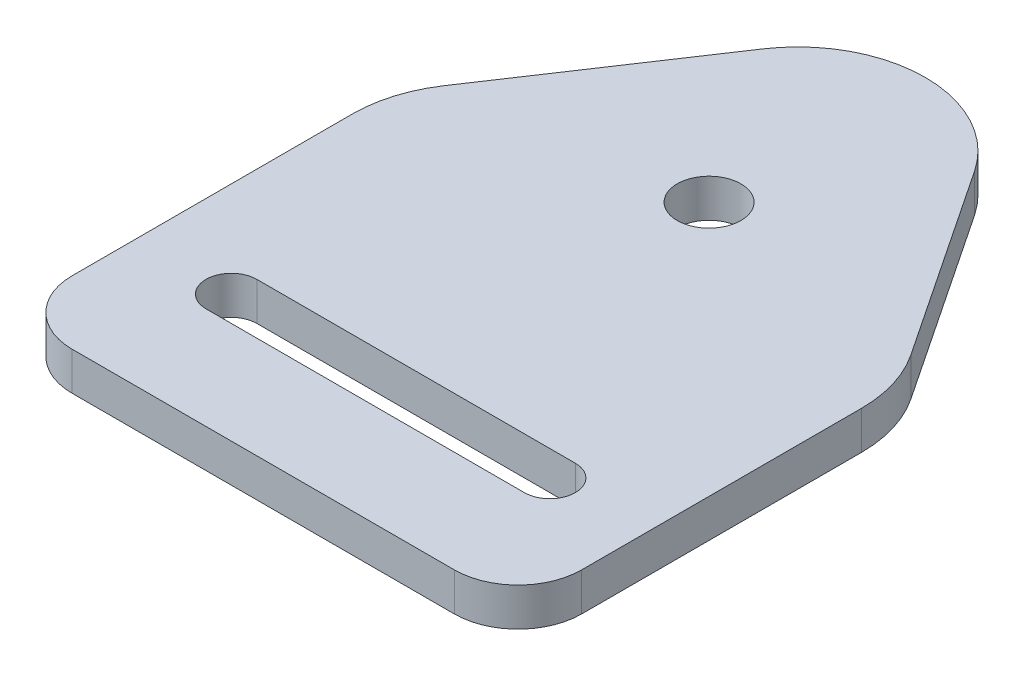
ISO-10303-21;
HEADER;
FILE_DESCRIPTION(('STEP AP214'),'2;1');
FILE_NAME('part.step','',(''),(''),'','','');
FILE_SCHEMA(('AUTOMOTIVE_DESIGN { 1 0 10303 214 1 1 1 1 }'));
ENDSEC;
DATA;
#1=APPLICATION_CONTEXT('core data for automotive mechanical design processes');
#2=APPLICATION_PROTOCOL_DEFINITION('international standard','automotive_design',2000,#1);
#3=PRODUCT_CONTEXT('',#1,'mechanical');
#4=PRODUCT('Part','Part','',(#3));
#5=PRODUCT_RELATED_PRODUCT_CATEGORY('part','',(#4));
#6=PRODUCT_DEFINITION_FORMATION('','',#4);
#7=PRODUCT_DEFINITION_CONTEXT('part definition',#1,'design');
#8=PRODUCT_DEFINITION('design','',#6,#7);
#9=PRODUCT_DEFINITION_SHAPE('','',#8);
#10=(LENGTH_UNIT() NAMED_UNIT(*) SI_UNIT(.MILLI.,.METRE.));
#11=(NAMED_UNIT(*) PLANE_ANGLE_UNIT() SI_UNIT($,.RADIAN.));
#12=(NAMED_UNIT(*) SI_UNIT($,.STERADIAN.) SOLID_ANGLE_UNIT());
#13=UNCERTAINTY_MEASURE_WITH_UNIT(LENGTH_MEASURE(1.E-05),#10,'distance_accuracy_value','');
#14=(GEOMETRIC_REPRESENTATION_CONTEXT(3) GLOBAL_UNCERTAINTY_ASSIGNED_CONTEXT((#13)) GLOBAL_UNIT_ASSIGNED_CONTEXT((#10,
#11,#12)) REPRESENTATION_CONTEXT('',''));
#15=CARTESIAN_POINT('',(0.,0.,0.));
#16=DIRECTION('',(0.,0.,1.));
#17=DIRECTION('',(1.,0.,0.));
#18=AXIS2_PLACEMENT_3D('',#15,#16,#17);
#19=CARTESIAN_POINT('',(20.,3.,0.));
#20=DIRECTION('',(-1.,0.,0.));
#21=DIRECTION('',(0.,0.,1.));
#22=AXIS2_PLACEMENT_3D('',#19,#20,#21);
#23=PLANE('',#22);
#24=DIRECTION('',(0.,0.,-1.));
#25=VECTOR('',#24,1.);
#26=CARTESIAN_POINT('',(20.,3.,0.));
#27=LINE('',#26,#25);
#28=CARTESIAN_POINT('',(20.,3.,-5.00000000000001));
#29=VERTEX_POINT('',#28);
#30=CARTESIAN_POINT('',(20.,3.,-26.9722436226801));
#31=VERTEX_POINT('',#30);
#32=EDGE_CURVE('E177',#29,#31,#27,.T.);
#33=ORIENTED_EDGE('',*,*,#32,.F.);
#34=DIRECTION('',(0.,-1.,0.));
#35=VECTOR('',#34,1.);
#36=CARTESIAN_POINT('',(20.,3.,-5.00000000000001));
#37=LINE('',#36,#35);
#38=CARTESIAN_POINT('',(20.,0.,-5.00000000000001));
#39=VERTEX_POINT('',#38);
#40=EDGE_CURVE('E238',#29,#39,#37,.T.);
#41=ORIENTED_EDGE('',*,*,#40,.T.);
#42=DIRECTION('',(0.,0.,-1.));
#43=VECTOR('',#42,1.);
#44=CARTESIAN_POINT('',(20.,0.,0.));
#45=LINE('',#44,#43);
#46=CARTESIAN_POINT('',(20.,0.,-26.9722436226801));
#47=VERTEX_POINT('',#46);
#48=EDGE_CURVE('E168',#39,#47,#45,.T.);
#49=ORIENTED_EDGE('',*,*,#48,.T.);
#50=DIRECTION('',(0.,-1.,0.));
#51=VECTOR('',#50,1.);
#52=CARTESIAN_POINT('',(20.,3.,-26.9722436226801));
#53=LINE('',#52,#51);
#54=EDGE_CURVE('E236',#47,#31,#53,.F.);
#55=ORIENTED_EDGE('',*,*,#54,.T.);
#56=EDGE_LOOP('',(#33,#41,#49,#55));
#57=FACE_BOUND('',#56,.T.);
#58=ADVANCED_FACE('F34',(#57),#23,.F.);
#59=CARTESIAN_POINT('',(20.,3.,-30.));
#60=DIRECTION('',(-0.832050294337843,0.,0.554700196225229));
#61=DIRECTION('',(0.554700196225229,0.,0.832050294337844));
#62=AXIS2_PLACEMENT_3D('',#59,#60,#61);
#63=PLANE('',#62);
#64=DIRECTION('',(-0.554700196225229,0.,-0.832050294337844));
#65=VECTOR('',#64,1.);
#66=CARTESIAN_POINT('',(20.,0.,-30.));
#67=LINE('',#66,#65);
#68=CARTESIAN_POINT('',(18.3205029433784,0.,-32.5192455849323));
#69=VERTEX_POINT('',#68);
#70=CARTESIAN_POINT('',(8.32050294337843,0.,-47.5192455849323));
#71=VERTEX_POINT('',#70);
#72=EDGE_CURVE('E196',#69,#71,#67,.T.);
#73=ORIENTED_EDGE('',*,*,#72,.T.);
#74=DIRECTION('',(0.,-1.,0.));
#75=VECTOR('',#74,1.);
#76=CARTESIAN_POINT('',(8.32050294337844,3.,-47.5192455849323));
#77=LINE('',#76,#75);
#78=CARTESIAN_POINT('',(8.32050294337843,3.,-47.5192455849323));
#79=VERTEX_POINT('',#78);
#80=EDGE_CURVE('E12',#71,#79,#77,.F.);
#81=ORIENTED_EDGE('',*,*,#80,.T.);
#82=DIRECTION('',(-0.554700196225229,0.,-0.832050294337844));
#83=VECTOR('',#82,1.);
#84=CARTESIAN_POINT('',(20.,3.,-30.));
#85=LINE('',#84,#83);
#86=CARTESIAN_POINT('',(18.3205029433784,3.,-32.5192455849323));
#87=VERTEX_POINT('',#86);
#88=EDGE_CURVE('E180',#87,#79,#85,.T.);
#89=ORIENTED_EDGE('',*,*,#88,.F.);
#90=DIRECTION('',(0.,-1.,0.));
#91=VECTOR('',#90,1.);
#92=CARTESIAN_POINT('',(18.3205029433784,3.,-32.5192455849323));
#93=LINE('',#92,#91);
#94=EDGE_CURVE('E42',#87,#69,#93,.T.);
#95=ORIENTED_EDGE('',*,*,#94,.T.);
#96=EDGE_LOOP('',(#73,#81,#89,#95));
#97=FACE_BOUND('',#96,.T.);
#98=ADVANCED_FACE('F250',(#97),#63,.F.);
#99=CARTESIAN_POINT('',(0.,3.,-60.));
#100=DIRECTION('',(0.832050294337843,0.,0.554700196225229));
#101=DIRECTION('',(0.554700196225229,0.,-0.832050294337844));
#102=AXIS2_PLACEMENT_3D('',#99,#100,#101);
#103=PLANE('',#102);
#104=DIRECTION('',(-0.554700196225229,0.,0.832050294337844));
#105=VECTOR('',#104,1.);
#106=CARTESIAN_POINT('',(0.,3.,-60.));
#107=LINE('',#106,#105);
#108=CARTESIAN_POINT('',(-8.32050294337844,3.,-47.5192455849323));
#109=VERTEX_POINT('',#108);
#110=CARTESIAN_POINT('',(-18.3205029433784,3.,-32.5192455849323));
#111=VERTEX_POINT('',#110);
#112=EDGE_CURVE('E184',#109,#111,#107,.T.);
#113=ORIENTED_EDGE('',*,*,#112,.F.);
#114=DIRECTION('',(0.,-1.,0.));
#115=VECTOR('',#114,1.);
#116=CARTESIAN_POINT('',(-8.32050294337844,3.,-47.5192455849323));
#117=LINE('',#116,#115);
#118=CARTESIAN_POINT('',(-8.32050294337844,0.,-47.5192455849323));
#119=VERTEX_POINT('',#118);
#120=EDGE_CURVE('E243',#109,#119,#117,.T.);
#121=ORIENTED_EDGE('',*,*,#120,.T.);
#122=DIRECTION('',(-0.554700196225229,0.,0.832050294337844));
#123=VECTOR('',#122,1.);
#124=CARTESIAN_POINT('',(0.,0.,-60.));
#125=LINE('',#124,#123);
#126=CARTESIAN_POINT('',(-18.3205029433784,0.,-32.5192455849323));
#127=VERTEX_POINT('',#126);
#128=EDGE_CURVE('E199',#119,#127,#125,.T.);
#129=ORIENTED_EDGE('',*,*,#128,.T.);
#130=DIRECTION('',(0.,-1.,0.));
#131=VECTOR('',#130,1.);
#132=CARTESIAN_POINT('',(-18.3205029433784,3.,-32.5192455849324));
#133=LINE('',#132,#131);
#134=EDGE_CURVE('E241',#127,#111,#133,.F.);
#135=ORIENTED_EDGE('',*,*,#134,.T.);
#136=EDGE_LOOP('',(#113,#121,#129,#135));
#137=FACE_BOUND('',#136,.T.);
#138=ADVANCED_FACE('F264',(#137),#103,.F.);
#139=CARTESIAN_POINT('',(-20.,3.,-30.));
#140=DIRECTION('',(1.,0.,0.));
#141=DIRECTION('',(0.,0.,-1.));
#142=AXIS2_PLACEMENT_3D('',#139,#140,#141);
#143=PLANE('',#142);
#144=DIRECTION('',(0.,0.,1.));
#145=VECTOR('',#144,1.);
#146=CARTESIAN_POINT('',(-20.,0.,-30.));
#147=LINE('',#146,#145);
#148=CARTESIAN_POINT('',(-20.,0.,-26.9722436226801));
#149=VERTEX_POINT('',#148);
#150=CARTESIAN_POINT('',(-20.,0.,-5.));
#151=VERTEX_POINT('',#150);
#152=EDGE_CURVE('E202',#149,#151,#147,.T.);
#153=ORIENTED_EDGE('',*,*,#152,.T.);
#154=DIRECTION('',(0.,-1.,0.));
#155=VECTOR('',#154,1.);
#156=CARTESIAN_POINT('',(-20.,3.,-5.));
#157=LINE('',#156,#155);
#158=CARTESIAN_POINT('',(-20.,3.,-5.));
#159=VERTEX_POINT('',#158);
#160=EDGE_CURVE('E224',#151,#159,#157,.F.);
#161=ORIENTED_EDGE('',*,*,#160,.T.);
#162=DIRECTION('',(0.,0.,1.));
#163=VECTOR('',#162,1.);
#164=CARTESIAN_POINT('',(-20.,3.,-30.));
#165=LINE('',#164,#163);
#166=CARTESIAN_POINT('',(-20.,3.,-26.9722436226801));
#167=VERTEX_POINT('',#166);
#168=EDGE_CURVE('E187',#167,#159,#165,.T.);
#169=ORIENTED_EDGE('',*,*,#168,.F.);
#170=DIRECTION('',(0.,-1.,0.));
#171=VECTOR('',#170,1.);
#172=CARTESIAN_POINT('',(-20.,3.,-26.9722436226801));
#173=LINE('',#172,#171);
#174=EDGE_CURVE('E221',#167,#149,#173,.T.);
#175=ORIENTED_EDGE('',*,*,#174,.T.);
#176=EDGE_LOOP('',(#153,#161,#169,#175));
#177=FACE_BOUND('',#176,.T.);
#178=ADVANCED_FACE('F275',(#177),#143,.F.);
#179=CARTESIAN_POINT('',(-20.,3.,0.));
#180=DIRECTION('',(0.,0.,-1.));
#181=DIRECTION('',(-1.,0.,0.));
#182=AXIS2_PLACEMENT_3D('',#179,#180,#181);
#183=PLANE('',#182);
#184=DIRECTION('',(1.,0.,0.));
#185=VECTOR('',#184,1.);
#186=CARTESIAN_POINT('',(-20.,3.,0.));
#187=LINE('',#186,#185);
#188=CARTESIAN_POINT('',(-15.,3.,0.));
#189=VERTEX_POINT('',#188);
#190=CARTESIAN_POINT('',(15.,3.,0.));
#191=VERTEX_POINT('',#190);
#192=EDGE_CURVE('E190',#189,#191,#187,.T.);
#193=ORIENTED_EDGE('',*,*,#192,.F.);
#194=DIRECTION('',(0.,-1.,0.));
#195=VECTOR('',#194,1.);
#196=CARTESIAN_POINT('',(-15.,3.,0.));
#197=LINE('',#196,#195);
#198=CARTESIAN_POINT('',(-15.,0.,0.));
#199=VERTEX_POINT('',#198);
#200=EDGE_CURVE('E208',#189,#199,#197,.T.);
#201=ORIENTED_EDGE('',*,*,#200,.T.);
#202=DIRECTION('',(1.,0.,0.));
#203=VECTOR('',#202,1.);
#204=CARTESIAN_POINT('',(-20.,0.,0.));
#205=LINE('',#204,#203);
#206=CARTESIAN_POINT('',(15.,0.,0.));
#207=VERTEX_POINT('',#206);
#208=EDGE_CURVE('E181',#199,#207,#205,.T.);
#209=ORIENTED_EDGE('',*,*,#208,.T.);
#210=DIRECTION('',(0.,-1.,0.));
#211=VECTOR('',#210,1.);
#212=CARTESIAN_POINT('',(15.,3.,0.));
#213=LINE('',#212,#211);
#214=EDGE_CURVE('E193',#207,#191,#213,.F.);
#215=ORIENTED_EDGE('',*,*,#214,.T.);
#216=EDGE_LOOP('',(#193,#201,#209,#215));
#217=FACE_BOUND('',#216,.T.);
#218=ADVANCED_FACE('F283',(#217),#183,.F.);
#219=CARTESIAN_POINT('',(0.,3.,0.));
#220=DIRECTION('',(0.,-1.,0.));
#221=DIRECTION('',(0.,0.,-1.));
#222=AXIS2_PLACEMENT_3D('',#219,#220,#221);
#223=PLANE('',#222);
#224=DIRECTION('',(1.,0.,0.));
#225=VECTOR('',#224,1.);
#226=CARTESIAN_POINT('',(-12.5,3.,-8.));
#227=LINE('',#226,#225);
#228=CARTESIAN_POINT('',(-12.5,3.,-8.));
#229=VERTEX_POINT('',#228);
#230=CARTESIAN_POINT('',(12.5,3.,-8.));
#231=VERTEX_POINT('',#230);
#232=EDGE_CURVE('E161',#229,#231,#227,.T.);
#233=ORIENTED_EDGE('',*,*,#232,.F.);
#234=CARTESIAN_POINT('',(-12.5,3.,-10.));
#235=DIRECTION('',(0.,1.,0.));
#236=DIRECTION('',(0.,0.,1.));
#237=AXIS2_PLACEMENT_3D('',#234,#235,#236);
#238=CIRCLE('',#237,2.);
#239=CARTESIAN_POINT('',(-12.5,3.,-12.));
#240=VERTEX_POINT('',#239);
#241=EDGE_CURVE('E49',#240,#229,#238,.T.);
#242=ORIENTED_EDGE('',*,*,#241,.F.);
#243=DIRECTION('',(-1.,0.,0.));
#244=VECTOR('',#243,1.);
#245=CARTESIAN_POINT('',(-12.5,3.,-12.));
#246=LINE('',#245,#244);
#247=CARTESIAN_POINT('',(12.5,3.,-12.));
#248=VERTEX_POINT('',#247);
#249=EDGE_CURVE('E152',#248,#240,#246,.T.);
#250=ORIENTED_EDGE('',*,*,#249,.F.);
#251=CARTESIAN_POINT('',(12.5,3.,-10.));
#252=DIRECTION('',(0.,1.,0.));
#253=DIRECTION('',(0.,0.,1.));
#254=AXIS2_PLACEMENT_3D('',#251,#252,#253);
#255=CIRCLE('',#254,2.);
#256=EDGE_CURVE('E155',#231,#248,#255,.T.);
#257=ORIENTED_EDGE('',*,*,#256,.F.);
#258=EDGE_LOOP('',(#233,#242,#250,#257));
#259=FACE_BOUND('',#258,.T.);
#260=CARTESIAN_POINT('',(0.,3.,-35.));
#261=DIRECTION('',(0.,1.,0.));
#262=DIRECTION('',(0.,0.,1.));
#263=AXIS2_PLACEMENT_3D('',#260,#261,#262);
#264=CIRCLE('',#263,2.5);
#265=CARTESIAN_POINT('',(0.,3.,-32.5));
#266=VERTEX_POINT('',#265);
#267=EDGE_CURVE('E174',#266,#266,#264,.T.);
#268=ORIENTED_EDGE('',*,*,#267,.F.);
#269=EDGE_LOOP('',(#268));
#270=FACE_BOUND('',#269,.T.);
#271=ORIENTED_EDGE('',*,*,#168,.T.);
#272=CARTESIAN_POINT('',(-15.,3.,-5.));
#273=DIRECTION('',(0.,-1.,0.));
#274=DIRECTION('',(0.,0.,-1.));
#275=AXIS2_PLACEMENT_3D('',#272,#273,#274);
#276=CIRCLE('',#275,5.);
#277=EDGE_CURVE('E234',#159,#189,#276,.F.);
#278=ORIENTED_EDGE('',*,*,#277,.T.);
#279=ORIENTED_EDGE('',*,*,#192,.T.);
#280=CARTESIAN_POINT('',(15.,3.,-5.00000000000001));
#281=DIRECTION('',(0.,-1.,0.));
#282=DIRECTION('',(0.,0.,-1.));
#283=AXIS2_PLACEMENT_3D('',#280,#281,#282);
#284=CIRCLE('',#283,5.);
#285=EDGE_CURVE('E232',#191,#29,#284,.F.);
#286=ORIENTED_EDGE('',*,*,#285,.T.);
#287=ORIENTED_EDGE('',*,*,#32,.T.);
#288=CARTESIAN_POINT('',(10.,3.,-26.9722436226801));
#289=DIRECTION('',(0.,-1.,0.));
#290=DIRECTION('',(0.,0.,-1.));
#291=AXIS2_PLACEMENT_3D('',#288,#289,#290);
#292=CIRCLE('',#291,10.);
#293=EDGE_CURVE('E226',#31,#87,#292,.F.);
#294=ORIENTED_EDGE('',*,*,#293,.T.);
#295=ORIENTED_EDGE('',*,*,#88,.T.);
#296=CARTESIAN_POINT('',(0.,3.,-41.9722436226801));
#297=DIRECTION('',(0.,-1.,0.));
#298=DIRECTION('',(0.,0.,-1.));
#299=AXIS2_PLACEMENT_3D('',#296,#297,#298);
#300=CIRCLE('',#299,10.);
#301=EDGE_CURVE('E230',#79,#109,#300,.F.);
#302=ORIENTED_EDGE('',*,*,#301,.T.);
#303=ORIENTED_EDGE('',*,*,#112,.T.);
#304=CARTESIAN_POINT('',(-10.,3.,-26.9722436226801));
#305=DIRECTION('',(0.,-1.,0.));
#306=DIRECTION('',(0.,0.,-1.));
#307=AXIS2_PLACEMENT_3D('',#304,#305,#306);
#308=CIRCLE('',#307,10.);
#309=EDGE_CURVE('E228',#111,#167,#308,.F.);
#310=ORIENTED_EDGE('',*,*,#309,.T.);
#311=EDGE_LOOP('',(#271,#278,#279,#286,#287,#294,#295,#302,#303,#310));
#312=FACE_BOUND('',#311,.T.);
#313=ADVANCED_FACE('F268',(#259,#270,#312),#223,.F.);
#314=CARTESIAN_POINT('',(0.,0.,0.));
#315=DIRECTION('',(0.,-1.,0.));
#316=DIRECTION('',(0.,0.,-1.));
#317=AXIS2_PLACEMENT_3D('',#314,#315,#316);
#318=PLANE('',#317);
#319=CARTESIAN_POINT('',(-12.5,0.,-10.));
#320=DIRECTION('',(0.,1.,0.));
#321=DIRECTION('',(0.,0.,1.));
#322=AXIS2_PLACEMENT_3D('',#319,#320,#321);
#323=CIRCLE('',#322,2.);
#324=CARTESIAN_POINT('',(-12.5,0.,-12.));
#325=VERTEX_POINT('',#324);
#326=CARTESIAN_POINT('',(-12.5,0.,-8.));
#327=VERTEX_POINT('',#326);
#328=EDGE_CURVE('E136',#325,#327,#323,.T.);
#329=ORIENTED_EDGE('',*,*,#328,.T.);
#330=DIRECTION('',(1.,0.,0.));
#331=VECTOR('',#330,1.);
#332=CARTESIAN_POINT('',(-12.5,0.,-8.));
#333=LINE('',#332,#331);
#334=CARTESIAN_POINT('',(12.5,0.,-8.));
#335=VERTEX_POINT('',#334);
#336=EDGE_CURVE('E145',#327,#335,#333,.T.);
#337=ORIENTED_EDGE('',*,*,#336,.T.);
#338=CARTESIAN_POINT('',(12.5,0.,-10.));
#339=DIRECTION('',(0.,1.,0.));
#340=DIRECTION('',(0.,0.,1.));
#341=AXIS2_PLACEMENT_3D('',#338,#339,#340);
#342=CIRCLE('',#341,2.);
#343=CARTESIAN_POINT('',(12.5,0.,-12.));
#344=VERTEX_POINT('',#343);
#345=EDGE_CURVE('E57',#335,#344,#342,.T.);
#346=ORIENTED_EDGE('',*,*,#345,.T.);
#347=DIRECTION('',(-1.,0.,0.));
#348=VECTOR('',#347,1.);
#349=CARTESIAN_POINT('',(-12.5,0.,-12.));
#350=LINE('',#349,#348);
#351=EDGE_CURVE('E142',#344,#325,#350,.T.);
#352=ORIENTED_EDGE('',*,*,#351,.T.);
#353=EDGE_LOOP('',(#329,#337,#346,#352));
#354=FACE_BOUND('',#353,.T.);
#355=CARTESIAN_POINT('',(0.,0.,-35.));
#356=DIRECTION('',(0.,1.,0.));
#357=DIRECTION('',(0.,0.,1.));
#358=AXIS2_PLACEMENT_3D('',#355,#356,#357);
#359=CIRCLE('',#358,2.5);
#360=CARTESIAN_POINT('',(0.,0.,-32.5));
#361=VERTEX_POINT('',#360);
#362=EDGE_CURVE('E162',#361,#361,#359,.T.);
#363=ORIENTED_EDGE('',*,*,#362,.T.);
#364=EDGE_LOOP('',(#363));
#365=FACE_BOUND('',#364,.T.);
#366=ORIENTED_EDGE('',*,*,#208,.F.);
#367=CARTESIAN_POINT('',(-15.,0.,-5.));
#368=DIRECTION('',(0.,-1.,0.));
#369=DIRECTION('',(0.,0.,-1.));
#370=AXIS2_PLACEMENT_3D('',#367,#368,#369);
#371=CIRCLE('',#370,5.);
#372=EDGE_CURVE('E219',#199,#151,#371,.T.);
#373=ORIENTED_EDGE('',*,*,#372,.T.);
#374=ORIENTED_EDGE('',*,*,#152,.F.);
#375=CARTESIAN_POINT('',(-10.,0.,-26.9722436226801));
#376=DIRECTION('',(0.,-1.,0.));
#377=DIRECTION('',(0.,0.,-1.));
#378=AXIS2_PLACEMENT_3D('',#375,#376,#377);
#379=CIRCLE('',#378,10.);
#380=EDGE_CURVE('E213',#149,#127,#379,.T.);
#381=ORIENTED_EDGE('',*,*,#380,.T.);
#382=ORIENTED_EDGE('',*,*,#128,.F.);
#383=CARTESIAN_POINT('',(0.,0.,-41.9722436226801));
#384=DIRECTION('',(0.,-1.,0.));
#385=DIRECTION('',(0.,0.,-1.));
#386=AXIS2_PLACEMENT_3D('',#383,#384,#385);
#387=CIRCLE('',#386,10.);
#388=EDGE_CURVE('E215',#119,#71,#387,.T.);
#389=ORIENTED_EDGE('',*,*,#388,.T.);
#390=ORIENTED_EDGE('',*,*,#72,.F.);
#391=CARTESIAN_POINT('',(10.,0.,-26.9722436226801));
#392=DIRECTION('',(0.,-1.,0.));
#393=DIRECTION('',(0.,0.,-1.));
#394=AXIS2_PLACEMENT_3D('',#391,#392,#393);
#395=CIRCLE('',#394,10.);
#396=EDGE_CURVE('E211',#69,#47,#395,.T.);
#397=ORIENTED_EDGE('',*,*,#396,.T.);
#398=ORIENTED_EDGE('',*,*,#48,.F.);
#399=CARTESIAN_POINT('',(15.,0.,-5.00000000000001));
#400=DIRECTION('',(0.,-1.,0.));
#401=DIRECTION('',(0.,0.,-1.));
#402=AXIS2_PLACEMENT_3D('',#399,#400,#401);
#403=CIRCLE('',#402,5.);
#404=EDGE_CURVE('E217',#39,#207,#403,.T.);
#405=ORIENTED_EDGE('',*,*,#404,.T.);
#406=EDGE_LOOP('',(#366,#373,#374,#381,#382,#389,#390,#397,#398,#405));
#407=FACE_BOUND('',#406,.T.);
#408=ADVANCED_FACE('F149',(#354,#365,#407),#318,.T.);
#409=CARTESIAN_POINT('',(-15.,3.,-5.));
#410=DIRECTION('',(0.,-1.,0.));
#411=DIRECTION('',(0.,0.,-1.));
#412=AXIS2_PLACEMENT_3D('',#409,#410,#411);
#413=CYLINDRICAL_SURFACE('',#412,5.);
#414=ORIENTED_EDGE('',*,*,#277,.F.);
#415=ORIENTED_EDGE('',*,*,#160,.F.);
#416=ORIENTED_EDGE('',*,*,#372,.F.);
#417=ORIENTED_EDGE('',*,*,#200,.F.);
#418=EDGE_LOOP('',(#414,#415,#416,#417));
#419=FACE_BOUND('',#418,.T.);
#420=ADVANCED_FACE('F280',(#419),#413,.T.);
#421=CARTESIAN_POINT('',(15.,3.,-5.00000000000001));
#422=DIRECTION('',(0.,-1.,0.));
#423=DIRECTION('',(0.,0.,-1.));
#424=AXIS2_PLACEMENT_3D('',#421,#422,#423);
#425=CYLINDRICAL_SURFACE('',#424,5.);
#426=ORIENTED_EDGE('',*,*,#285,.F.);
#427=ORIENTED_EDGE('',*,*,#214,.F.);
#428=ORIENTED_EDGE('',*,*,#404,.F.);
#429=ORIENTED_EDGE('',*,*,#40,.F.);
#430=EDGE_LOOP('',(#426,#427,#428,#429));
#431=FACE_BOUND('',#430,.T.);
#432=ADVANCED_FACE('F289',(#431),#425,.T.);
#433=CARTESIAN_POINT('',(0.,3.,-41.9722436226801));
#434=DIRECTION('',(0.,-1.,0.));
#435=DIRECTION('',(0.,0.,-1.));
#436=AXIS2_PLACEMENT_3D('',#433,#434,#435);
#437=CYLINDRICAL_SURFACE('',#436,10.);
#438=ORIENTED_EDGE('',*,*,#301,.F.);
#439=ORIENTED_EDGE('',*,*,#80,.F.);
#440=ORIENTED_EDGE('',*,*,#388,.F.);
#441=ORIENTED_EDGE('',*,*,#120,.F.);
#442=EDGE_LOOP('',(#438,#439,#440,#441));
#443=FACE_BOUND('',#442,.T.);
#444=ADVANCED_FACE('F261',(#443),#437,.T.);
#445=CARTESIAN_POINT('',(-10.,3.,-26.9722436226801));
#446=DIRECTION('',(0.,-1.,0.));
#447=DIRECTION('',(0.,0.,-1.));
#448=AXIS2_PLACEMENT_3D('',#445,#446,#447);
#449=CYLINDRICAL_SURFACE('',#448,10.);
#450=ORIENTED_EDGE('',*,*,#309,.F.);
#451=ORIENTED_EDGE('',*,*,#134,.F.);
#452=ORIENTED_EDGE('',*,*,#380,.F.);
#453=ORIENTED_EDGE('',*,*,#174,.F.);
#454=EDGE_LOOP('',(#450,#451,#452,#453));
#455=FACE_BOUND('',#454,.T.);
#456=ADVANCED_FACE('F272',(#455),#449,.T.);
#457=CARTESIAN_POINT('',(10.,3.,-26.9722436226801));
#458=DIRECTION('',(0.,-1.,0.));
#459=DIRECTION('',(0.,0.,-1.));
#460=AXIS2_PLACEMENT_3D('',#457,#458,#459);
#461=CYLINDRICAL_SURFACE('',#460,10.);
#462=ORIENTED_EDGE('',*,*,#293,.F.);
#463=ORIENTED_EDGE('',*,*,#54,.F.);
#464=ORIENTED_EDGE('',*,*,#396,.F.);
#465=ORIENTED_EDGE('',*,*,#94,.F.);
#466=EDGE_LOOP('',(#462,#463,#464,#465));
#467=FACE_BOUND('',#466,.T.);
#468=ADVANCED_FACE('F36',(#467),#461,.T.);
#469=CARTESIAN_POINT('',(0.,0.,-35.));
#470=DIRECTION('',(0.,1.,0.));
#471=DIRECTION('',(0.,0.,1.));
#472=AXIS2_PLACEMENT_3D('',#469,#470,#471);
#473=CYLINDRICAL_SURFACE('',#472,2.5);
#474=ORIENTED_EDGE('',*,*,#362,.F.);
#475=EDGE_LOOP('',(#474));
#476=FACE_BOUND('',#475,.T.);
#477=ORIENTED_EDGE('',*,*,#267,.T.);
#478=EDGE_LOOP('',(#477));
#479=FACE_BOUND('',#478,.T.);
#480=ADVANCED_FACE('F293',(#476,#479),#473,.F.);
#481=CARTESIAN_POINT('',(-12.5,0.,-10.));
#482=DIRECTION('',(0.,1.,0.));
#483=DIRECTION('',(0.,0.,1.));
#484=AXIS2_PLACEMENT_3D('',#481,#482,#483);
#485=CYLINDRICAL_SURFACE('',#484,2.);
#486=ORIENTED_EDGE('',*,*,#241,.T.);
#487=DIRECTION('',(0.,1.,0.));
#488=VECTOR('',#487,1.);
#489=CARTESIAN_POINT('',(-12.5,0.,-8.));
#490=LINE('',#489,#488);
#491=EDGE_CURVE('E132',#327,#229,#490,.T.);
#492=ORIENTED_EDGE('',*,*,#491,.F.);
#493=ORIENTED_EDGE('',*,*,#328,.F.);
#494=DIRECTION('',(0.,1.,0.));
#495=VECTOR('',#494,1.);
#496=CARTESIAN_POINT('',(-12.5,0.,-12.));
#497=LINE('',#496,#495);
#498=EDGE_CURVE('E166',#325,#240,#497,.T.);
#499=ORIENTED_EDGE('',*,*,#498,.T.);
#500=EDGE_LOOP('',(#486,#492,#493,#499));
#501=FACE_BOUND('',#500,.T.);
#502=ADVANCED_FACE('F134',(#501),#485,.F.);
#503=CARTESIAN_POINT('',(-12.5,0.,-12.));
#504=DIRECTION('',(0.,0.,-1.));
#505=DIRECTION('',(-1.,0.,0.));
#506=AXIS2_PLACEMENT_3D('',#503,#504,#505);
#507=PLANE('',#506);
#508=ORIENTED_EDGE('',*,*,#249,.T.);
#509=ORIENTED_EDGE('',*,*,#498,.F.);
#510=ORIENTED_EDGE('',*,*,#351,.F.);
#511=DIRECTION('',(0.,1.,0.));
#512=VECTOR('',#511,1.);
#513=CARTESIAN_POINT('',(12.5,0.,-12.));
#514=LINE('',#513,#512);
#515=EDGE_CURVE('E169',#344,#248,#514,.T.);
#516=ORIENTED_EDGE('',*,*,#515,.T.);
#517=EDGE_LOOP('',(#508,#509,#510,#516));
#518=FACE_BOUND('',#517,.T.);
#519=ADVANCED_FACE('F360',(#518),#507,.F.);
#520=CARTESIAN_POINT('',(12.5,0.,-10.));
#521=DIRECTION('',(0.,1.,0.));
#522=DIRECTION('',(0.,0.,1.));
#523=AXIS2_PLACEMENT_3D('',#520,#521,#522);
#524=CYLINDRICAL_SURFACE('',#523,2.);
#525=ORIENTED_EDGE('',*,*,#256,.T.);
#526=ORIENTED_EDGE('',*,*,#515,.F.);
#527=ORIENTED_EDGE('',*,*,#345,.F.);
#528=DIRECTION('',(0.,1.,0.));
#529=VECTOR('',#528,1.);
#530=CARTESIAN_POINT('',(12.5,0.,-8.));
#531=LINE('',#530,#529);
#532=EDGE_CURVE('E141',#335,#231,#531,.T.);
#533=ORIENTED_EDGE('',*,*,#532,.T.);
#534=EDGE_LOOP('',(#525,#526,#527,#533));
#535=FACE_BOUND('',#534,.T.);
#536=ADVANCED_FACE('F369',(#535),#524,.F.);
#537=CARTESIAN_POINT('',(-12.5,0.,-8.));
#538=DIRECTION('',(0.,0.,1.));
#539=DIRECTION('',(1.,0.,0.));
#540=AXIS2_PLACEMENT_3D('',#537,#538,#539);
#541=PLANE('',#540);
#542=ORIENTED_EDGE('',*,*,#232,.T.);
#543=ORIENTED_EDGE('',*,*,#532,.F.);
#544=ORIENTED_EDGE('',*,*,#336,.F.);
#545=ORIENTED_EDGE('',*,*,#491,.T.);
#546=EDGE_LOOP('',(#542,#543,#544,#545));
#547=FACE_BOUND('',#546,.T.);
#548=ADVANCED_FACE('F146',(#547),#541,.F.);
#549=CLOSED_SHELL('',(#58,#98,#138,#178,#218,#313,#408,#420,#432,#444,#456,#468,#480,#502,#519,
#536,#548));
#550=MANIFOLD_SOLID_BREP('B2',#549);
#551=ADVANCED_BREP_SHAPE_REPRESENTATION('',(#18,#550),#14);
#552=SHAPE_DEFINITION_REPRESENTATION(#9,#551);
ENDSEC;
END-ISO-10303-21;
